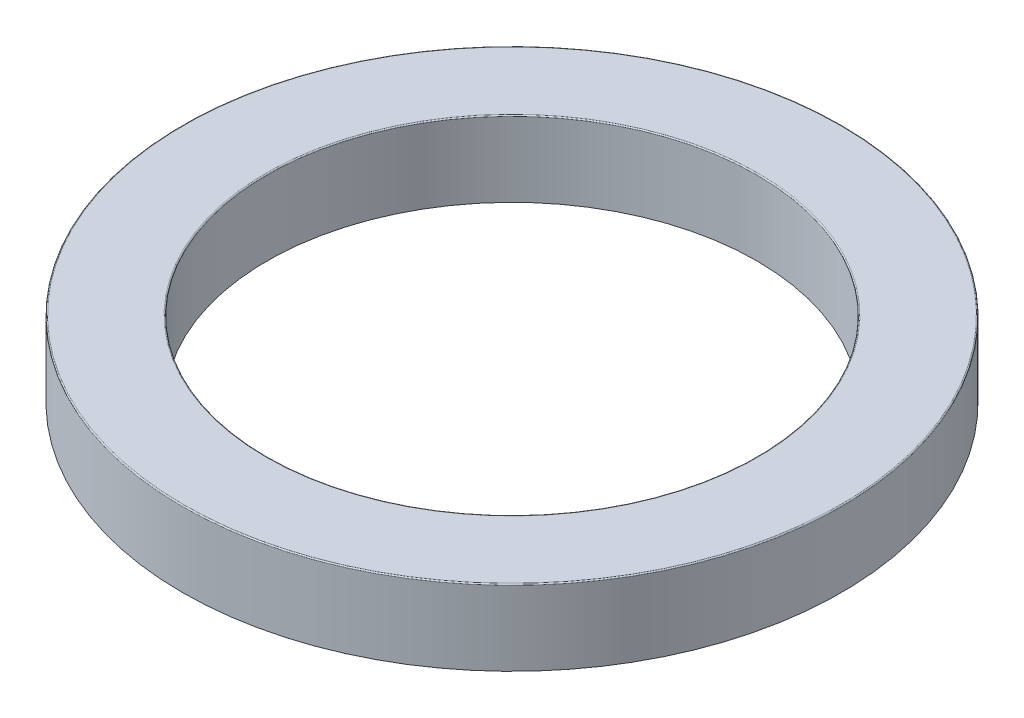
ISO-10303-21;
HEADER;
FILE_DESCRIPTION(('STEP AP214'),'2;1');
FILE_NAME('part.step','',(''),(''),'','','');
FILE_SCHEMA(('AUTOMOTIVE_DESIGN { 1 0 10303 214 1 1 1 1 }'));
ENDSEC;
DATA;
#1=APPLICATION_CONTEXT('core data for automotive mechanical design processes');
#2=APPLICATION_PROTOCOL_DEFINITION('international standard','automotive_design',2000,#1);
#3=PRODUCT_CONTEXT('',#1,'mechanical');
#4=PRODUCT('Part','Part','',(#3));
#5=PRODUCT_RELATED_PRODUCT_CATEGORY('part','',(#4));
#6=PRODUCT_DEFINITION_FORMATION('','',#4);
#7=PRODUCT_DEFINITION_CONTEXT('part definition',#1,'design');
#8=PRODUCT_DEFINITION('design','',#6,#7);
#9=PRODUCT_DEFINITION_SHAPE('','',#8);
#10=(LENGTH_UNIT() NAMED_UNIT(*) SI_UNIT(.MILLI.,.METRE.));
#11=(NAMED_UNIT(*) PLANE_ANGLE_UNIT() SI_UNIT($,.RADIAN.));
#12=(NAMED_UNIT(*) SI_UNIT($,.STERADIAN.) SOLID_ANGLE_UNIT());
#13=UNCERTAINTY_MEASURE_WITH_UNIT(LENGTH_MEASURE(1.E-05),#10,'distance_accuracy_value','');
#14=(GEOMETRIC_REPRESENTATION_CONTEXT(3) GLOBAL_UNCERTAINTY_ASSIGNED_CONTEXT((#13)) GLOBAL_UNIT_ASSIGNED_CONTEXT((#10,
#11,#12)) REPRESENTATION_CONTEXT('',''));
#15=CARTESIAN_POINT('',(0.,0.,0.));
#16=DIRECTION('',(0.,0.,1.));
#17=DIRECTION('',(1.,0.,0.));
#18=AXIS2_PLACEMENT_3D('',#15,#16,#17);
#19=CARTESIAN_POINT('',(0.,1.625,0.));
#20=DIRECTION('',(0.,-1.,0.));
#21=DIRECTION('',(0.,0.,-1.));
#22=AXIS2_PLACEMENT_3D('',#19,#20,#21);
#23=TOROIDAL_SURFACE('',#22,5.375,0.025);
#24=CARTESIAN_POINT('',(0.,1.65,0.));
#25=DIRECTION('',(0.,-1.,0.));
#26=DIRECTION('',(0.,0.,-1.));
#27=AXIS2_PLACEMENT_3D('',#24,#25,#26);
#28=CIRCLE('',#27,5.375);
#29=CARTESIAN_POINT('',(0.,1.65,-5.375));
#30=VERTEX_POINT('',#29);
#31=EDGE_CURVE('E33',#30,#30,#28,.T.);
#32=ORIENTED_EDGE('',*,*,#31,.F.);
#33=EDGE_LOOP('',(#32));
#34=FACE_BOUND('',#33,.T.);
#35=CARTESIAN_POINT('',(0.,1.625,0.));
#36=DIRECTION('',(0.,1.,0.));
#37=DIRECTION('',(0.,0.,-1.));
#38=AXIS2_PLACEMENT_3D('',#35,#36,#37);
#39=CIRCLE('',#38,5.35);
#40=CARTESIAN_POINT('',(0.,1.625,-5.35));
#41=VERTEX_POINT('',#40);
#42=EDGE_CURVE('E27',#41,#41,#39,.T.);
#43=ORIENTED_EDGE('',*,*,#42,.F.);
#44=EDGE_LOOP('',(#43));
#45=FACE_BOUND('',#44,.T.);
#46=ADVANCED_FACE('F15',(#34,#45),#23,.T.);
#47=CARTESIAN_POINT('',(0.,1.625,0.));
#48=DIRECTION('',(0.,-1.,0.));
#49=DIRECTION('',(0.,0.,-1.));
#50=AXIS2_PLACEMENT_3D('',#47,#48,#49);
#51=TOROIDAL_SURFACE('',#50,7.175,0.025);
#52=CARTESIAN_POINT('',(0.,1.625,0.));
#53=DIRECTION('',(0.,-1.,0.));
#54=DIRECTION('',(0.,0.,-1.));
#55=AXIS2_PLACEMENT_3D('',#52,#53,#54);
#56=CIRCLE('',#55,7.2);
#57=CARTESIAN_POINT('',(0.,1.625,-7.2));
#58=VERTEX_POINT('',#57);
#59=EDGE_CURVE('E10',#58,#58,#56,.T.);
#60=ORIENTED_EDGE('',*,*,#59,.F.);
#61=EDGE_LOOP('',(#60));
#62=FACE_BOUND('',#61,.T.);
#63=CARTESIAN_POINT('',(0.,1.65,0.));
#64=DIRECTION('',(0.,1.,0.));
#65=DIRECTION('',(0.,0.,-1.));
#66=AXIS2_PLACEMENT_3D('',#63,#64,#65);
#67=CIRCLE('',#66,7.175);
#68=CARTESIAN_POINT('',(0.,1.65,-7.175));
#69=VERTEX_POINT('',#68);
#70=EDGE_CURVE('E29',#69,#69,#67,.T.);
#71=ORIENTED_EDGE('',*,*,#70,.F.);
#72=EDGE_LOOP('',(#71));
#73=FACE_BOUND('',#72,.T.);
#74=ADVANCED_FACE('F47',(#62,#73),#51,.T.);
#75=CARTESIAN_POINT('',(0.,1.65,0.));
#76=DIRECTION('',(0.,-1.,0.));
#77=DIRECTION('',(0.,0.,-1.));
#78=AXIS2_PLACEMENT_3D('',#75,#76,#77);
#79=CYLINDRICAL_SURFACE('',#78,7.2);
#80=CARTESIAN_POINT('',(0.,0.,0.));
#81=DIRECTION('',(0.,-1.,0.));
#82=DIRECTION('',(0.,0.,-1.));
#83=AXIS2_PLACEMENT_3D('',#80,#81,#82);
#84=CIRCLE('',#83,7.2);
#85=CARTESIAN_POINT('',(0.,0.,-7.2));
#86=VERTEX_POINT('',#85);
#87=EDGE_CURVE('E31',#86,#86,#84,.T.);
#88=ORIENTED_EDGE('',*,*,#87,.F.);
#89=EDGE_LOOP('',(#88));
#90=FACE_BOUND('',#89,.T.);
#91=ORIENTED_EDGE('',*,*,#59,.T.);
#92=EDGE_LOOP('',(#91));
#93=FACE_BOUND('',#92,.T.);
#94=ADVANCED_FACE('F54',(#90,#93),#79,.T.);
#95=CARTESIAN_POINT('',(0.,1.65,0.));
#96=DIRECTION('',(0.,-1.,0.));
#97=DIRECTION('',(0.,0.,-1.));
#98=AXIS2_PLACEMENT_3D('',#95,#96,#97);
#99=CYLINDRICAL_SURFACE('',#98,5.35);
#100=CARTESIAN_POINT('',(0.,0.,0.));
#101=DIRECTION('',(0.,-1.,0.));
#102=DIRECTION('',(0.,0.,-1.));
#103=AXIS2_PLACEMENT_3D('',#100,#101,#102);
#104=CIRCLE('',#103,5.35);
#105=CARTESIAN_POINT('',(0.,0.,-5.35));
#106=VERTEX_POINT('',#105);
#107=EDGE_CURVE('E19',#106,#106,#104,.T.);
#108=ORIENTED_EDGE('',*,*,#107,.T.);
#109=EDGE_LOOP('',(#108));
#110=FACE_BOUND('',#109,.T.);
#111=ORIENTED_EDGE('',*,*,#42,.T.);
#112=EDGE_LOOP('',(#111));
#113=FACE_BOUND('',#112,.T.);
#114=ADVANCED_FACE('F44',(#110,#113),#99,.F.);
#115=CARTESIAN_POINT('',(0.,1.65,0.));
#116=DIRECTION('',(0.,-1.,0.));
#117=DIRECTION('',(0.,0.,-1.));
#118=AXIS2_PLACEMENT_3D('',#115,#116,#117);
#119=PLANE('',#118);
#120=ORIENTED_EDGE('',*,*,#70,.T.);
#121=EDGE_LOOP('',(#120));
#122=FACE_BOUND('',#121,.T.);
#123=ORIENTED_EDGE('',*,*,#31,.T.);
#124=EDGE_LOOP('',(#123));
#125=FACE_BOUND('',#124,.T.);
#126=ADVANCED_FACE('F62',(#122,#125),#119,.F.);
#127=CARTESIAN_POINT('',(0.,0.,0.));
#128=DIRECTION('',(0.,-1.,0.));
#129=DIRECTION('',(0.,0.,-1.));
#130=AXIS2_PLACEMENT_3D('',#127,#128,#129);
#131=PLANE('',#130);
#132=ORIENTED_EDGE('',*,*,#107,.F.);
#133=EDGE_LOOP('',(#132));
#134=FACE_BOUND('',#133,.T.);
#135=ORIENTED_EDGE('',*,*,#87,.T.);
#136=EDGE_LOOP('',(#135));
#137=FACE_BOUND('',#136,.T.);
#138=ADVANCED_FACE('F17',(#134,#137),#131,.T.);
#139=CLOSED_SHELL('',(#46,#74,#94,#114,#126,#138));
#140=MANIFOLD_SOLID_BREP('B1',#139);
#141=ADVANCED_BREP_SHAPE_REPRESENTATION('',(#18,#140),#14);
#142=SHAPE_DEFINITION_REPRESENTATION(#9,#141);
ENDSEC;
END-ISO-10303-21;
